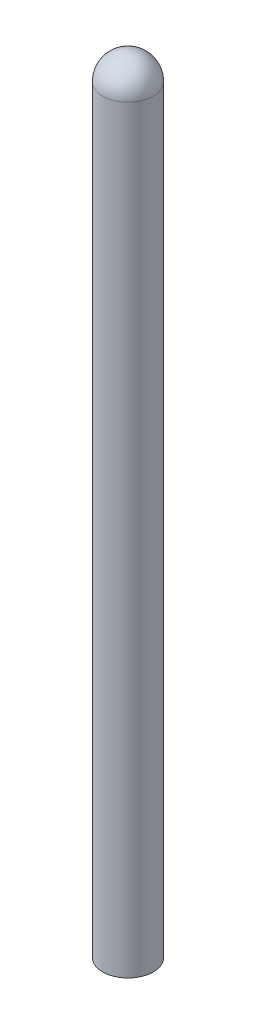
ISO-10303-21;
HEADER;
FILE_DESCRIPTION(('STEP AP214'),'2;1');
FILE_NAME('part.step','',(''),(''),'','','');
FILE_SCHEMA(('AUTOMOTIVE_DESIGN { 1 0 10303 214 1 1 1 1 }'));
ENDSEC;
DATA;
#1=APPLICATION_CONTEXT('core data for automotive mechanical design processes');
#2=APPLICATION_PROTOCOL_DEFINITION('international standard','automotive_design',2000,#1);
#3=PRODUCT_CONTEXT('',#1,'mechanical');
#4=PRODUCT('Part','Part','',(#3));
#5=PRODUCT_RELATED_PRODUCT_CATEGORY('part','',(#4));
#6=PRODUCT_DEFINITION_FORMATION('','',#4);
#7=PRODUCT_DEFINITION_CONTEXT('part definition',#1,'design');
#8=PRODUCT_DEFINITION('design','',#6,#7);
#9=PRODUCT_DEFINITION_SHAPE('','',#8);
#10=(LENGTH_UNIT() NAMED_UNIT(*) SI_UNIT(.MILLI.,.METRE.));
#11=(NAMED_UNIT(*) PLANE_ANGLE_UNIT() SI_UNIT($,.RADIAN.));
#12=(NAMED_UNIT(*) SI_UNIT($,.STERADIAN.) SOLID_ANGLE_UNIT());
#13=UNCERTAINTY_MEASURE_WITH_UNIT(LENGTH_MEASURE(1.E-05),#10,'distance_accuracy_value','');
#14=(GEOMETRIC_REPRESENTATION_CONTEXT(3) GLOBAL_UNCERTAINTY_ASSIGNED_CONTEXT((#13)) GLOBAL_UNIT_ASSIGNED_CONTEXT((#10,
#11,#12)) REPRESENTATION_CONTEXT('',''));
#15=CARTESIAN_POINT('',(0.,0.,0.));
#16=DIRECTION('',(0.,0.,1.));
#17=DIRECTION('',(1.,0.,0.));
#18=AXIS2_PLACEMENT_3D('',#15,#16,#17);
#19=CARTESIAN_POINT('',(0.,0.,0.));
#20=DIRECTION('',(0.,1.,0.));
#21=DIRECTION('',(0.,0.,1.));
#22=AXIS2_PLACEMENT_3D('',#19,#20,#21);
#23=PLANE('',#22);
#24=CARTESIAN_POINT('',(0.,0.,0.));
#25=DIRECTION('',(0.,1.,0.));
#26=DIRECTION('',(0.,0.,1.));
#27=AXIS2_PLACEMENT_3D('',#24,#25,#26);
#28=CIRCLE('',#27,5.);
#29=CARTESIAN_POINT('',(0.,0.,5.));
#30=VERTEX_POINT('',#29);
#31=EDGE_CURVE('E46',#30,#30,#28,.T.);
#32=ORIENTED_EDGE('',*,*,#31,.F.);
#33=EDGE_LOOP('',(#32));
#34=FACE_BOUND('',#33,.T.);
#35=CARTESIAN_POINT('',(0.,0.,0.));
#36=DIRECTION('',(0.,1.,0.));
#37=DIRECTION('',(0.,0.,1.));
#38=AXIS2_PLACEMENT_3D('',#35,#36,#37);
#39=CIRCLE('',#38,3.);
#40=CARTESIAN_POINT('',(0.,0.,3.));
#41=VERTEX_POINT('',#40);
#42=EDGE_CURVE('E50',#41,#41,#39,.T.);
#43=ORIENTED_EDGE('',*,*,#42,.T.);
#44=EDGE_LOOP('',(#43));
#45=FACE_BOUND('',#44,.T.);
#46=ADVANCED_FACE('F39',(#34,#45),#23,.F.);
#47=CARTESIAN_POINT('',(0.,150.,0.));
#48=DIRECTION('',(0.,-1.,0.));
#49=DIRECTION('',(0.,0.,-1.));
#50=AXIS2_PLACEMENT_3D('',#47,#48,#49);
#51=CYLINDRICAL_SURFACE('',#50,5.);
#52=CARTESIAN_POINT('',(0.,150.,0.));
#53=DIRECTION('',(0.,-1.,0.));
#54=DIRECTION('',(0.,0.,-1.));
#55=AXIS2_PLACEMENT_3D('',#52,#53,#54);
#56=CIRCLE('',#55,5.);
#57=CARTESIAN_POINT('',(0.,150.,-5.));
#58=VERTEX_POINT('',#57);
#59=EDGE_CURVE('E10',#58,#58,#56,.T.);
#60=ORIENTED_EDGE('',*,*,#59,.T.);
#61=EDGE_LOOP('',(#60));
#62=FACE_BOUND('',#61,.T.);
#63=ORIENTED_EDGE('',*,*,#31,.T.);
#64=EDGE_LOOP('',(#63));
#65=FACE_BOUND('',#64,.T.);
#66=ADVANCED_FACE('F72',(#62,#65),#51,.T.);
#67=CARTESIAN_POINT('',(0.,150.,0.));
#68=DIRECTION('',(0.,-1.,0.));
#69=DIRECTION('',(0.,0.,-1.));
#70=AXIS2_PLACEMENT_3D('',#67,#68,#69);
#71=CYLINDRICAL_SURFACE('',#70,3.);
#72=CARTESIAN_POINT('',(0.,150.,0.));
#73=DIRECTION('',(0.,1.,0.));
#74=DIRECTION('',(0.,0.,1.));
#75=AXIS2_PLACEMENT_3D('',#72,#73,#74);
#76=CIRCLE('',#75,3.);
#77=CARTESIAN_POINT('',(0.,150.,3.));
#78=VERTEX_POINT('',#77);
#79=EDGE_CURVE('E54',#78,#78,#76,.T.);
#80=ORIENTED_EDGE('',*,*,#79,.T.);
#81=EDGE_LOOP('',(#80));
#82=FACE_BOUND('',#81,.T.);
#83=ORIENTED_EDGE('',*,*,#42,.F.);
#84=EDGE_LOOP('',(#83));
#85=FACE_BOUND('',#84,.T.);
#86=ADVANCED_FACE('F60',(#82,#85),#71,.F.);
#87=CARTESIAN_POINT('',(0.,150.,0.));
#88=DIRECTION('',(0.,1.,0.));
#89=DIRECTION('',(0.,0.,1.));
#90=AXIS2_PLACEMENT_3D('',#87,#88,#89);
#91=PLANE('',#90);
#92=ORIENTED_EDGE('',*,*,#79,.F.);
#93=EDGE_LOOP('',(#92));
#94=FACE_BOUND('',#93,.T.);
#95=ADVANCED_FACE('F63',(#94),#91,.F.);
#96=CARTESIAN_POINT('',(0.,150.,0.));
#97=DIRECTION('',(0.,1.,0.));
#98=DIRECTION('',(0.,0.,1.));
#99=AXIS2_PLACEMENT_3D('',#96,#97,#98);
#100=SPHERICAL_SURFACE('',#99,5.);
#101=ORIENTED_EDGE('',*,*,#59,.F.);
#102=EDGE_LOOP('',(#101));
#103=FACE_BOUND('',#102,.T.);
#104=ADVANCED_FACE('F41',(#103),#100,.T.);
#105=CLOSED_SHELL('',(#46,#66,#86,#95,#104));
#106=MANIFOLD_SOLID_BREP('B2',#105);
#107=ADVANCED_BREP_SHAPE_REPRESENTATION('',(#18,#106),#14);
#108=SHAPE_DEFINITION_REPRESENTATION(#9,#107);
ENDSEC;
END-ISO-10303-21;
